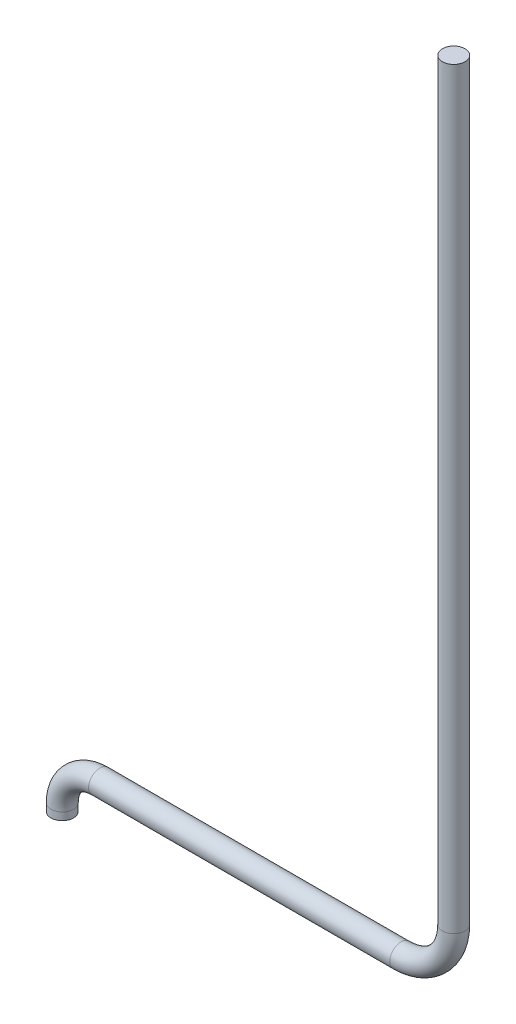
ISO-10303-21;
HEADER;
FILE_DESCRIPTION(('STEP AP214'),'2;1');
FILE_NAME('part.step','',(''),(''),'','','');
FILE_SCHEMA(('AUTOMOTIVE_DESIGN { 1 0 10303 214 1 1 1 1 }'));
ENDSEC;
DATA;
#1=APPLICATION_CONTEXT('core data for automotive mechanical design processes');
#2=APPLICATION_PROTOCOL_DEFINITION('international standard','automotive_design',2000,#1);
#3=PRODUCT_CONTEXT('',#1,'mechanical');
#4=PRODUCT('Part','Part','',(#3));
#5=PRODUCT_RELATED_PRODUCT_CATEGORY('part','',(#4));
#6=PRODUCT_DEFINITION_FORMATION('','',#4);
#7=PRODUCT_DEFINITION_CONTEXT('part definition',#1,'design');
#8=PRODUCT_DEFINITION('design','',#6,#7);
#9=PRODUCT_DEFINITION_SHAPE('','',#8);
#10=(LENGTH_UNIT() NAMED_UNIT(*) SI_UNIT(.MILLI.,.METRE.));
#11=(NAMED_UNIT(*) PLANE_ANGLE_UNIT() SI_UNIT($,.RADIAN.));
#12=(NAMED_UNIT(*) SI_UNIT($,.STERADIAN.) SOLID_ANGLE_UNIT());
#13=UNCERTAINTY_MEASURE_WITH_UNIT(LENGTH_MEASURE(1.E-05),#10,'distance_accuracy_value','');
#14=(GEOMETRIC_REPRESENTATION_CONTEXT(3) GLOBAL_UNCERTAINTY_ASSIGNED_CONTEXT((#13)) GLOBAL_UNIT_ASSIGNED_CONTEXT((#10,
#11,#12)) REPRESENTATION_CONTEXT('',''));
#15=CARTESIAN_POINT('',(0.,0.,0.));
#16=DIRECTION('',(0.,0.,1.));
#17=DIRECTION('',(1.,0.,0.));
#18=AXIS2_PLACEMENT_3D('',#15,#16,#17);
#19=CARTESIAN_POINT('',(0.,0.,0.));
#20=DIRECTION('',(0.,1.,0.));
#21=DIRECTION('',(0.,0.,1.));
#22=AXIS2_PLACEMENT_3D('',#19,#20,#21);
#23=PLANE('',#22);
#24=CARTESIAN_POINT('',(0.,0.,0.));
#25=DIRECTION('',(0.,1.,0.));
#26=DIRECTION('',(0.,0.,1.));
#27=AXIS2_PLACEMENT_3D('',#24,#25,#26);
#28=CIRCLE('',#27,10.);
#29=CARTESIAN_POINT('',(0.,0.,10.));
#30=VERTEX_POINT('',#29);
#31=EDGE_CURVE('E68',#30,#30,#28,.T.);
#32=ORIENTED_EDGE('',*,*,#31,.T.);
#33=EDGE_LOOP('',(#32));
#34=FACE_BOUND('',#33,.T.);
#35=CARTESIAN_POINT('',(0.,0.,0.));
#36=DIRECTION('',(0.,1.,0.));
#37=DIRECTION('',(0.,0.,1.));
#38=AXIS2_PLACEMENT_3D('',#35,#36,#37);
#39=CIRCLE('',#38,15.);
#40=CARTESIAN_POINT('',(0.,0.,15.));
#41=VERTEX_POINT('',#40);
#42=EDGE_CURVE('E63',#41,#41,#39,.T.);
#43=ORIENTED_EDGE('',*,*,#42,.F.);
#44=EDGE_LOOP('',(#43));
#45=FACE_BOUND('',#44,.T.);
#46=ADVANCED_FACE('F36',(#34,#45),#23,.F.);
#47=CARTESIAN_POINT('',(520.,1130.,0.));
#48=DIRECTION('',(0.,1.,0.));
#49=DIRECTION('',(0.,0.,1.));
#50=AXIS2_PLACEMENT_3D('',#47,#48,#49);
#51=PLANE('',#50);
#52=CARTESIAN_POINT('',(520.,1130.,0.));
#53=DIRECTION('',(0.,1.,0.));
#54=DIRECTION('',(0.,0.,1.));
#55=AXIS2_PLACEMENT_3D('',#52,#53,#54);
#56=CIRCLE('',#55,15.);
#57=CARTESIAN_POINT('',(520.,1130.,15.));
#58=VERTEX_POINT('',#57);
#59=EDGE_CURVE('E10',#58,#58,#56,.T.);
#60=ORIENTED_EDGE('',*,*,#59,.T.);
#61=EDGE_LOOP('',(#60));
#62=FACE_BOUND('',#61,.T.);
#63=ADVANCED_FACE('F128',(#62),#51,.T.);
#64=CARTESIAN_POINT('',(0.,0.,0.));
#65=DIRECTION('',(0.,1.,0.));
#66=DIRECTION('',(0.,0.,1.));
#67=AXIS2_PLACEMENT_3D('',#64,#65,#66);
#68=CYLINDRICAL_SURFACE('',#67,15.);
#69=CARTESIAN_POINT('',(0.,10.,0.));
#70=DIRECTION('',(0.,1.,0.));
#71=DIRECTION('',(0.,0.,1.));
#72=AXIS2_PLACEMENT_3D('',#69,#70,#71);
#73=CIRCLE('',#72,15.);
#74=CARTESIAN_POINT('',(-15.,10.,0.));
#75=VERTEX_POINT('',#74);
#76=EDGE_CURVE('E59',#75,#75,#73,.T.);
#77=ORIENTED_EDGE('',*,*,#76,.F.);
#78=EDGE_LOOP('',(#77));
#79=FACE_BOUND('',#78,.T.);
#80=ORIENTED_EDGE('',*,*,#42,.T.);
#81=EDGE_LOOP('',(#80));
#82=FACE_BOUND('',#81,.T.);
#83=ADVANCED_FACE('F124',(#79,#82),#68,.T.);
#84=CARTESIAN_POINT('',(50.,10.,0.));
#85=DIRECTION('',(0.,0.,-1.));
#86=DIRECTION('',(-1.,0.,0.));
#87=AXIS2_PLACEMENT_3D('',#84,#85,#86);
#88=TOROIDAL_SURFACE('',#87,50.,15.);
#89=CARTESIAN_POINT('',(50.,60.,0.));
#90=DIRECTION('',(1.,0.,0.));
#91=DIRECTION('',(0.,0.,1.));
#92=AXIS2_PLACEMENT_3D('',#89,#90,#91);
#93=CIRCLE('',#92,15.);
#94=CARTESIAN_POINT('',(50.,75.,0.));
#95=VERTEX_POINT('',#94);
#96=EDGE_CURVE('E53',#95,#95,#93,.T.);
#97=CARTESIAN_POINT('',(50.,10.,0.));
#98=DIRECTION('',(0.,0.,-1.));
#99=DIRECTION('',(-1.,0.,0.));
#100=AXIS2_PLACEMENT_3D('',#97,#98,#99);
#101=CIRCLE('',#100,65.);
#102=EDGE_CURVE('',#75,#95,#101,.T.);
#103=ORIENTED_EDGE('',*,*,#76,.T.);
#104=ORIENTED_EDGE('',*,*,#96,.F.);
#105=ORIENTED_EDGE('',*,*,#102,.T.);
#106=ORIENTED_EDGE('',*,*,#102,.F.);
#107=EDGE_LOOP('',(#103,#105,#104,#106));
#108=FACE_BOUND('',#107,.T.);
#109=ADVANCED_FACE('F127',(#108),#88,.T.);
#110=CARTESIAN_POINT('',(50.,60.,0.));
#111=DIRECTION('',(1.,0.,0.));
#112=DIRECTION('',(0.,1.,0.));
#113=AXIS2_PLACEMENT_3D('',#110,#111,#112);
#114=CYLINDRICAL_SURFACE('',#113,15.);
#115=CARTESIAN_POINT('',(450.,60.,0.));
#116=DIRECTION('',(1.,0.,0.));
#117=DIRECTION('',(0.,0.,1.));
#118=AXIS2_PLACEMENT_3D('',#115,#116,#117);
#119=CIRCLE('',#118,15.);
#120=CARTESIAN_POINT('',(450.,45.,0.));
#121=VERTEX_POINT('',#120);
#122=EDGE_CURVE('E48',#121,#121,#119,.T.);
#123=ORIENTED_EDGE('',*,*,#122,.F.);
#124=EDGE_LOOP('',(#123));
#125=FACE_BOUND('',#124,.T.);
#126=ORIENTED_EDGE('',*,*,#96,.T.);
#127=EDGE_LOOP('',(#126));
#128=FACE_BOUND('',#127,.T.);
#129=ADVANCED_FACE('F132',(#125,#128),#114,.T.);
#130=CARTESIAN_POINT('',(450.,130.,0.));
#131=DIRECTION('',(0.,0.,1.));
#132=DIRECTION('',(1.,0.,0.));
#133=AXIS2_PLACEMENT_3D('',#130,#131,#132);
#134=TOROIDAL_SURFACE('',#133,70.,15.);
#135=CARTESIAN_POINT('',(520.,130.,0.));
#136=DIRECTION('',(0.,1.,0.));
#137=DIRECTION('',(0.,0.,1.));
#138=AXIS2_PLACEMENT_3D('',#135,#136,#137);
#139=CIRCLE('',#138,15.);
#140=CARTESIAN_POINT('',(535.,130.,0.));
#141=VERTEX_POINT('',#140);
#142=EDGE_CURVE('E43',#141,#141,#139,.T.);
#143=CARTESIAN_POINT('',(450.,130.,0.));
#144=DIRECTION('',(0.,0.,1.));
#145=DIRECTION('',(1.,0.,0.));
#146=AXIS2_PLACEMENT_3D('',#143,#144,#145);
#147=CIRCLE('',#146,85.);
#148=EDGE_CURVE('',#121,#141,#147,.T.);
#149=ORIENTED_EDGE('',*,*,#122,.T.);
#150=ORIENTED_EDGE('',*,*,#142,.F.);
#151=ORIENTED_EDGE('',*,*,#148,.T.);
#152=ORIENTED_EDGE('',*,*,#148,.F.);
#153=EDGE_LOOP('',(#149,#151,#150,#152));
#154=FACE_BOUND('',#153,.T.);
#155=ADVANCED_FACE('F107',(#154),#134,.T.);
#156=CARTESIAN_POINT('',(520.,130.,0.));
#157=DIRECTION('',(0.,1.,0.));
#158=DIRECTION('',(0.,0.,1.));
#159=AXIS2_PLACEMENT_3D('',#156,#157,#158);
#160=CYLINDRICAL_SURFACE('',#159,15.);
#161=ORIENTED_EDGE('',*,*,#59,.F.);
#162=EDGE_LOOP('',(#161));
#163=FACE_BOUND('',#162,.T.);
#164=ORIENTED_EDGE('',*,*,#142,.T.);
#165=EDGE_LOOP('',(#164));
#166=FACE_BOUND('',#165,.T.);
#167=ADVANCED_FACE('F98',(#163,#166),#160,.T.);
#168=CARTESIAN_POINT('',(520.,1125.,0.));
#169=DIRECTION('',(0.,1.,0.));
#170=DIRECTION('',(0.,0.,1.));
#171=AXIS2_PLACEMENT_3D('',#168,#169,#170);
#172=PLANE('',#171);
#173=CARTESIAN_POINT('',(520.,1125.,0.));
#174=DIRECTION('',(0.,1.,0.));
#175=DIRECTION('',(0.,0.,1.));
#176=AXIS2_PLACEMENT_3D('',#173,#174,#175);
#177=CIRCLE('',#176,10.);
#178=CARTESIAN_POINT('',(520.,1125.,10.));
#179=VERTEX_POINT('',#178);
#180=EDGE_CURVE('E67',#179,#179,#177,.T.);
#181=ORIENTED_EDGE('',*,*,#180,.F.);
#182=EDGE_LOOP('',(#181));
#183=FACE_BOUND('',#182,.T.);
#184=ADVANCED_FACE('F95',(#183),#172,.F.);
#185=CARTESIAN_POINT('',(0.,0.,0.));
#186=DIRECTION('',(0.,1.,0.));
#187=DIRECTION('',(0.,0.,1.));
#188=AXIS2_PLACEMENT_3D('',#185,#186,#187);
#189=CYLINDRICAL_SURFACE('',#188,10.);
#190=CARTESIAN_POINT('',(0.,10.,0.));
#191=DIRECTION('',(0.,-1.,0.));
#192=DIRECTION('',(1.,0.,0.));
#193=AXIS2_PLACEMENT_3D('',#190,#191,#192);
#194=CIRCLE('',#193,10.);
#195=CARTESIAN_POINT('',(-9.99999999999999,10.,0.));
#196=VERTEX_POINT('',#195);
#197=EDGE_CURVE('E72',#196,#196,#194,.F.);
#198=ORIENTED_EDGE('',*,*,#197,.T.);
#199=EDGE_LOOP('',(#198));
#200=FACE_BOUND('',#199,.T.);
#201=ORIENTED_EDGE('',*,*,#31,.F.);
#202=EDGE_LOOP('',(#201));
#203=FACE_BOUND('',#202,.T.);
#204=ADVANCED_FACE('F97',(#200,#203),#189,.F.);
#205=CARTESIAN_POINT('',(50.,10.,0.));
#206=DIRECTION('',(0.,0.,-1.));
#207=DIRECTION('',(-1.,0.,0.));
#208=AXIS2_PLACEMENT_3D('',#205,#206,#207);
#209=TOROIDAL_SURFACE('',#208,50.,10.);
#210=CARTESIAN_POINT('',(50.,60.,0.));
#211=DIRECTION('',(1.,0.,0.));
#212=DIRECTION('',(0.,1.,0.));
#213=AXIS2_PLACEMENT_3D('',#210,#211,#212);
#214=CIRCLE('',#213,10.);
#215=CARTESIAN_POINT('',(50.,70.,0.));
#216=VERTEX_POINT('',#215);
#217=EDGE_CURVE('E76',#216,#216,#214,.T.);
#218=CARTESIAN_POINT('',(50.,10.,0.));
#219=DIRECTION('',(0.,0.,-1.));
#220=DIRECTION('',(-1.,0.,0.));
#221=AXIS2_PLACEMENT_3D('',#218,#219,#220);
#222=CIRCLE('',#221,60.);
#223=EDGE_CURVE('',#196,#216,#222,.T.);
#224=ORIENTED_EDGE('',*,*,#197,.F.);
#225=ORIENTED_EDGE('',*,*,#217,.T.);
#226=ORIENTED_EDGE('',*,*,#223,.T.);
#227=ORIENTED_EDGE('',*,*,#223,.F.);
#228=EDGE_LOOP('',(#224,#226,#225,#227));
#229=FACE_BOUND('',#228,.T.);
#230=ADVANCED_FACE('F104',(#229),#209,.F.);
#231=CARTESIAN_POINT('',(50.,60.,0.));
#232=DIRECTION('',(1.,0.,0.));
#233=DIRECTION('',(0.,1.,0.));
#234=AXIS2_PLACEMENT_3D('',#231,#232,#233);
#235=CYLINDRICAL_SURFACE('',#234,10.);
#236=CARTESIAN_POINT('',(450.,60.,0.));
#237=DIRECTION('',(-1.,0.,0.));
#238=DIRECTION('',(0.,-1.,0.));
#239=AXIS2_PLACEMENT_3D('',#236,#237,#238);
#240=CIRCLE('',#239,10.);
#241=CARTESIAN_POINT('',(450.,50.,0.));
#242=VERTEX_POINT('',#241);
#243=EDGE_CURVE('E80',#242,#242,#240,.F.);
#244=ORIENTED_EDGE('',*,*,#243,.T.);
#245=EDGE_LOOP('',(#244));
#246=FACE_BOUND('',#245,.T.);
#247=ORIENTED_EDGE('',*,*,#217,.F.);
#248=EDGE_LOOP('',(#247));
#249=FACE_BOUND('',#248,.T.);
#250=ADVANCED_FACE('F113',(#246,#249),#235,.F.);
#251=CARTESIAN_POINT('',(450.,130.,0.));
#252=DIRECTION('',(0.,0.,1.));
#253=DIRECTION('',(1.,0.,0.));
#254=AXIS2_PLACEMENT_3D('',#251,#252,#253);
#255=TOROIDAL_SURFACE('',#254,70.,10.);
#256=CARTESIAN_POINT('',(520.,130.,0.));
#257=DIRECTION('',(0.,1.,0.));
#258=DIRECTION('',(0.,0.,1.));
#259=AXIS2_PLACEMENT_3D('',#256,#257,#258);
#260=CIRCLE('',#259,10.);
#261=CARTESIAN_POINT('',(530.,130.,0.));
#262=VERTEX_POINT('',#261);
#263=EDGE_CURVE('E84',#262,#262,#260,.T.);
#264=CARTESIAN_POINT('',(450.,130.,0.));
#265=DIRECTION('',(0.,0.,1.));
#266=DIRECTION('',(1.,0.,0.));
#267=AXIS2_PLACEMENT_3D('',#264,#265,#266);
#268=CIRCLE('',#267,80.);
#269=EDGE_CURVE('',#242,#262,#268,.T.);
#270=ORIENTED_EDGE('',*,*,#243,.F.);
#271=ORIENTED_EDGE('',*,*,#263,.T.);
#272=ORIENTED_EDGE('',*,*,#269,.T.);
#273=ORIENTED_EDGE('',*,*,#269,.F.);
#274=EDGE_LOOP('',(#270,#272,#271,#273));
#275=FACE_BOUND('',#274,.T.);
#276=ADVANCED_FACE('F117',(#275),#255,.F.);
#277=CARTESIAN_POINT('',(520.,130.,0.));
#278=DIRECTION('',(0.,1.,0.));
#279=DIRECTION('',(0.,0.,1.));
#280=AXIS2_PLACEMENT_3D('',#277,#278,#279);
#281=CYLINDRICAL_SURFACE('',#280,10.);
#282=ORIENTED_EDGE('',*,*,#180,.T.);
#283=EDGE_LOOP('',(#282));
#284=FACE_BOUND('',#283,.T.);
#285=ORIENTED_EDGE('',*,*,#263,.F.);
#286=EDGE_LOOP('',(#285));
#287=FACE_BOUND('',#286,.T.);
#288=ADVANCED_FACE('F92',(#284,#287),#281,.F.);
#289=CLOSED_SHELL('',(#46,#63,#83,#109,#129,#155,#167,#184,#204,#230,#250,#276,#288));
#290=MANIFOLD_SOLID_BREP('B2',#289);
#291=ADVANCED_BREP_SHAPE_REPRESENTATION('',(#18,#290),#14);
#292=SHAPE_DEFINITION_REPRESENTATION(#9,#291);
ENDSEC;
END-ISO-10303-21;
